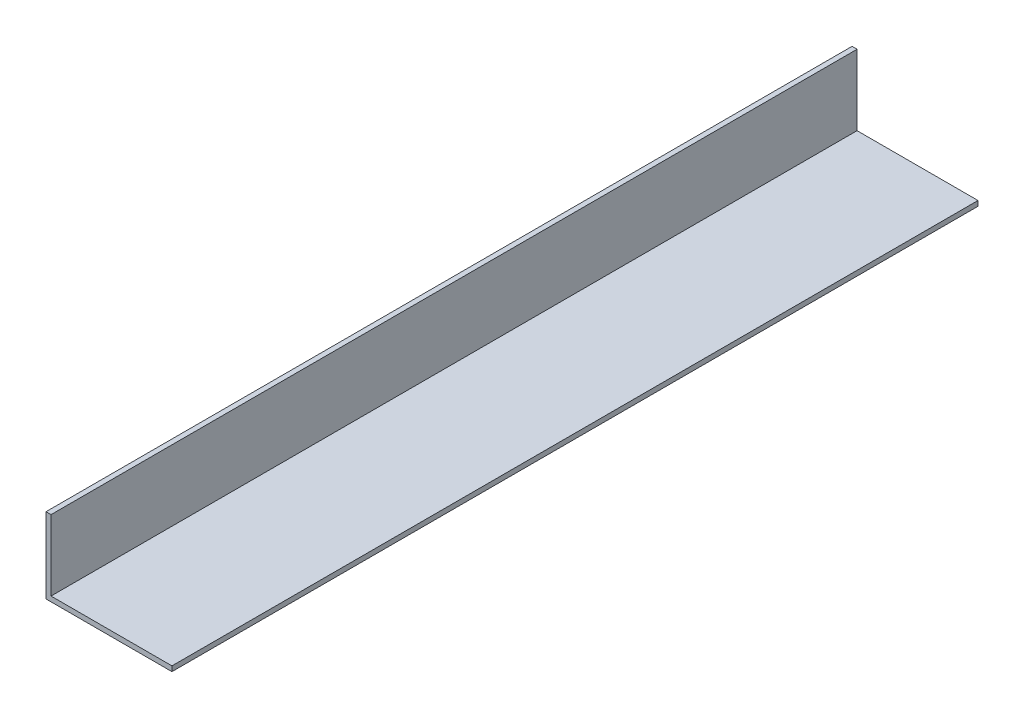
ISO-10303-21;
HEADER;
FILE_DESCRIPTION(('STEP AP214'),'2;1');
FILE_NAME('part.step','',(''),(''),'','','');
FILE_SCHEMA(('AUTOMOTIVE_DESIGN { 1 0 10303 214 1 1 1 1 }'));
ENDSEC;
DATA;
#1=APPLICATION_CONTEXT('core data for automotive mechanical design processes');
#2=APPLICATION_PROTOCOL_DEFINITION('international standard','automotive_design',2000,#1);
#3=PRODUCT_CONTEXT('',#1,'mechanical');
#4=PRODUCT('Part','Part','',(#3));
#5=PRODUCT_RELATED_PRODUCT_CATEGORY('part','',(#4));
#6=PRODUCT_DEFINITION_FORMATION('','',#4);
#7=PRODUCT_DEFINITION_CONTEXT('part definition',#1,'design');
#8=PRODUCT_DEFINITION('design','',#6,#7);
#9=PRODUCT_DEFINITION_SHAPE('','',#8);
#10=(LENGTH_UNIT() NAMED_UNIT(*) SI_UNIT(.MILLI.,.METRE.));
#11=(NAMED_UNIT(*) PLANE_ANGLE_UNIT() SI_UNIT($,.RADIAN.));
#12=(NAMED_UNIT(*) SI_UNIT($,.STERADIAN.) SOLID_ANGLE_UNIT());
#13=UNCERTAINTY_MEASURE_WITH_UNIT(LENGTH_MEASURE(1.E-05),#10,'distance_accuracy_value','');
#14=(GEOMETRIC_REPRESENTATION_CONTEXT(3) GLOBAL_UNCERTAINTY_ASSIGNED_CONTEXT((#13)) GLOBAL_UNIT_ASSIGNED_CONTEXT((#10,
#11,#12)) REPRESENTATION_CONTEXT('',''));
#15=CARTESIAN_POINT('',(0.,0.,0.));
#16=DIRECTION('',(0.,0.,1.));
#17=DIRECTION('',(1.,0.,0.));
#18=AXIS2_PLACEMENT_3D('',#15,#16,#17);
#19=CARTESIAN_POINT('',(50.,0.,320.));
#20=DIRECTION('',(0.,1.,0.));
#21=DIRECTION('',(-1.,0.,0.));
#22=AXIS2_PLACEMENT_3D('',#19,#20,#21);
#23=PLANE('',#22);
#24=DIRECTION('',(1.,0.,0.));
#25=VECTOR('',#24,1.);
#26=CARTESIAN_POINT('',(50.,0.,0.));
#27=LINE('',#26,#25);
#28=CARTESIAN_POINT('',(0.,0.,0.));
#29=VERTEX_POINT('',#28);
#30=CARTESIAN_POINT('',(50.,0.,0.));
#31=VERTEX_POINT('',#30);
#32=EDGE_CURVE('E119',#29,#31,#27,.T.);
#33=ORIENTED_EDGE('',*,*,#32,.T.);
#34=DIRECTION('',(0.,0.,-1.));
#35=VECTOR('',#34,1.);
#36=CARTESIAN_POINT('',(50.,0.,320.));
#37=LINE('',#36,#35);
#38=CARTESIAN_POINT('',(50.,0.,320.));
#39=VERTEX_POINT('',#38);
#40=EDGE_CURVE('E11',#39,#31,#37,.T.);
#41=ORIENTED_EDGE('',*,*,#40,.F.);
#42=DIRECTION('',(1.,0.,0.));
#43=VECTOR('',#42,1.);
#44=CARTESIAN_POINT('',(50.,0.,320.));
#45=LINE('',#44,#43);
#46=CARTESIAN_POINT('',(0.,0.,320.));
#47=VERTEX_POINT('',#46);
#48=EDGE_CURVE('E129',#47,#39,#45,.T.);
#49=ORIENTED_EDGE('',*,*,#48,.F.);
#50=DIRECTION('',(0.,0.,-1.));
#51=VECTOR('',#50,1.);
#52=CARTESIAN_POINT('',(0.,0.,320.));
#53=LINE('',#52,#51);
#54=EDGE_CURVE('E115',#47,#29,#53,.T.);
#55=ORIENTED_EDGE('',*,*,#54,.T.);
#56=EDGE_LOOP('',(#33,#41,#49,#55));
#57=FACE_BOUND('',#56,.T.);
#58=ADVANCED_FACE('F35',(#57),#23,.F.);
#59=CARTESIAN_POINT('',(50.,2.,320.));
#60=DIRECTION('',(-1.,0.,0.));
#61=DIRECTION('',(0.,0.,1.));
#62=AXIS2_PLACEMENT_3D('',#59,#60,#61);
#63=PLANE('',#62);
#64=DIRECTION('',(0.,1.,0.));
#65=VECTOR('',#64,1.);
#66=CARTESIAN_POINT('',(50.,2.,0.));
#67=LINE('',#66,#65);
#68=CARTESIAN_POINT('',(50.,2.,0.));
#69=VERTEX_POINT('',#68);
#70=EDGE_CURVE('E122',#31,#69,#67,.T.);
#71=ORIENTED_EDGE('',*,*,#70,.T.);
#72=DIRECTION('',(0.,0.,-1.));
#73=VECTOR('',#72,1.);
#74=CARTESIAN_POINT('',(50.,2.,320.));
#75=LINE('',#74,#73);
#76=CARTESIAN_POINT('',(50.,2.,320.));
#77=VERTEX_POINT('',#76);
#78=EDGE_CURVE('E43',#77,#69,#75,.T.);
#79=ORIENTED_EDGE('',*,*,#78,.F.);
#80=DIRECTION('',(0.,1.,0.));
#81=VECTOR('',#80,1.);
#82=CARTESIAN_POINT('',(50.,2.,320.));
#83=LINE('',#82,#81);
#84=EDGE_CURVE('E88',#39,#77,#83,.T.);
#85=ORIENTED_EDGE('',*,*,#84,.F.);
#86=ORIENTED_EDGE('',*,*,#40,.T.);
#87=EDGE_LOOP('',(#71,#79,#85,#86));
#88=FACE_BOUND('',#87,.T.);
#89=ADVANCED_FACE('F153',(#88),#63,.F.);
#90=CARTESIAN_POINT('',(2.,2.,320.));
#91=DIRECTION('',(0.,-1.,0.));
#92=DIRECTION('',(0.,0.,-1.));
#93=AXIS2_PLACEMENT_3D('',#90,#91,#92);
#94=PLANE('',#93);
#95=DIRECTION('',(-1.,0.,0.));
#96=VECTOR('',#95,1.);
#97=CARTESIAN_POINT('',(2.,2.,0.));
#98=LINE('',#97,#96);
#99=CARTESIAN_POINT('',(2.,2.,0.));
#100=VERTEX_POINT('',#99);
#101=EDGE_CURVE('E124',#69,#100,#98,.T.);
#102=ORIENTED_EDGE('',*,*,#101,.T.);
#103=DIRECTION('',(0.,0.,-1.));
#104=VECTOR('',#103,1.);
#105=CARTESIAN_POINT('',(2.,2.,320.));
#106=LINE('',#105,#104);
#107=CARTESIAN_POINT('',(2.,2.,320.));
#108=VERTEX_POINT('',#107);
#109=EDGE_CURVE('E110',#108,#100,#106,.T.);
#110=ORIENTED_EDGE('',*,*,#109,.F.);
#111=DIRECTION('',(-1.,0.,0.));
#112=VECTOR('',#111,1.);
#113=CARTESIAN_POINT('',(2.,2.,320.));
#114=LINE('',#113,#112);
#115=EDGE_CURVE('E101',#77,#108,#114,.T.);
#116=ORIENTED_EDGE('',*,*,#115,.F.);
#117=ORIENTED_EDGE('',*,*,#78,.T.);
#118=EDGE_LOOP('',(#102,#110,#116,#117));
#119=FACE_BOUND('',#118,.T.);
#120=ADVANCED_FACE('F135',(#119),#94,.F.);
#121=CARTESIAN_POINT('',(2.,30.,320.));
#122=DIRECTION('',(-1.,0.,0.));
#123=DIRECTION('',(0.,0.,1.));
#124=AXIS2_PLACEMENT_3D('',#121,#122,#123);
#125=PLANE('',#124);
#126=DIRECTION('',(0.,1.,0.));
#127=VECTOR('',#126,1.);
#128=CARTESIAN_POINT('',(2.,30.,0.));
#129=LINE('',#128,#127);
#130=CARTESIAN_POINT('',(2.,30.,0.));
#131=VERTEX_POINT('',#130);
#132=EDGE_CURVE('E109',#100,#131,#129,.T.);
#133=ORIENTED_EDGE('',*,*,#132,.T.);
#134=DIRECTION('',(0.,0.,-1.));
#135=VECTOR('',#134,1.);
#136=CARTESIAN_POINT('',(2.,30.,320.));
#137=LINE('',#136,#135);
#138=CARTESIAN_POINT('',(2.,30.,320.));
#139=VERTEX_POINT('',#138);
#140=EDGE_CURVE('E106',#139,#131,#137,.T.);
#141=ORIENTED_EDGE('',*,*,#140,.F.);
#142=DIRECTION('',(0.,1.,0.));
#143=VECTOR('',#142,1.);
#144=CARTESIAN_POINT('',(2.,30.,320.));
#145=LINE('',#144,#143);
#146=EDGE_CURVE('E95',#108,#139,#145,.T.);
#147=ORIENTED_EDGE('',*,*,#146,.F.);
#148=ORIENTED_EDGE('',*,*,#109,.T.);
#149=EDGE_LOOP('',(#133,#141,#147,#148));
#150=FACE_BOUND('',#149,.T.);
#151=ADVANCED_FACE('F107',(#150),#125,.F.);
#152=CARTESIAN_POINT('',(0.,30.,320.));
#153=DIRECTION('',(0.,-1.,0.));
#154=DIRECTION('',(0.,0.,-1.));
#155=AXIS2_PLACEMENT_3D('',#152,#153,#154);
#156=PLANE('',#155);
#157=DIRECTION('',(-1.,0.,0.));
#158=VECTOR('',#157,1.);
#159=CARTESIAN_POINT('',(0.,30.,0.));
#160=LINE('',#159,#158);
#161=CARTESIAN_POINT('',(0.,30.,0.));
#162=VERTEX_POINT('',#161);
#163=EDGE_CURVE('E74',#131,#162,#160,.T.);
#164=ORIENTED_EDGE('',*,*,#163,.T.);
#165=DIRECTION('',(0.,0.,-1.));
#166=VECTOR('',#165,1.);
#167=CARTESIAN_POINT('',(0.,30.,320.));
#168=LINE('',#167,#166);
#169=CARTESIAN_POINT('',(0.,30.,320.));
#170=VERTEX_POINT('',#169);
#171=EDGE_CURVE('E111',#170,#162,#168,.T.);
#172=ORIENTED_EDGE('',*,*,#171,.F.);
#173=DIRECTION('',(-1.,0.,0.));
#174=VECTOR('',#173,1.);
#175=CARTESIAN_POINT('',(0.,30.,320.));
#176=LINE('',#175,#174);
#177=EDGE_CURVE('E99',#139,#170,#176,.T.);
#178=ORIENTED_EDGE('',*,*,#177,.F.);
#179=ORIENTED_EDGE('',*,*,#140,.T.);
#180=EDGE_LOOP('',(#164,#172,#178,#179));
#181=FACE_BOUND('',#180,.T.);
#182=ADVANCED_FACE('F113',(#181),#156,.F.);
#183=CARTESIAN_POINT('',(0.,0.,320.));
#184=DIRECTION('',(1.,0.,0.));
#185=DIRECTION('',(0.,0.,-1.));
#186=AXIS2_PLACEMENT_3D('',#183,#184,#185);
#187=PLANE('',#186);
#188=DIRECTION('',(0.,-1.,0.));
#189=VECTOR('',#188,1.);
#190=CARTESIAN_POINT('',(0.,0.,0.));
#191=LINE('',#190,#189);
#192=EDGE_CURVE('E80',#162,#29,#191,.T.);
#193=ORIENTED_EDGE('',*,*,#192,.T.);
#194=ORIENTED_EDGE('',*,*,#54,.F.);
#195=DIRECTION('',(0.,-1.,0.));
#196=VECTOR('',#195,1.);
#197=CARTESIAN_POINT('',(0.,0.,320.));
#198=LINE('',#197,#196);
#199=EDGE_CURVE('E51',#170,#47,#198,.T.);
#200=ORIENTED_EDGE('',*,*,#199,.F.);
#201=ORIENTED_EDGE('',*,*,#171,.T.);
#202=EDGE_LOOP('',(#193,#194,#200,#201));
#203=FACE_BOUND('',#202,.T.);
#204=ADVANCED_FACE('F142',(#203),#187,.F.);
#205=CARTESIAN_POINT('',(0.,0.,320.));
#206=DIRECTION('',(0.,0.,-1.));
#207=DIRECTION('',(-1.,0.,0.));
#208=AXIS2_PLACEMENT_3D('',#205,#206,#207);
#209=PLANE('',#208);
#210=ORIENTED_EDGE('',*,*,#48,.T.);
#211=ORIENTED_EDGE('',*,*,#84,.T.);
#212=ORIENTED_EDGE('',*,*,#115,.T.);
#213=ORIENTED_EDGE('',*,*,#146,.T.);
#214=ORIENTED_EDGE('',*,*,#177,.T.);
#215=ORIENTED_EDGE('',*,*,#199,.T.);
#216=EDGE_LOOP('',(#210,#211,#212,#213,#214,#215));
#217=FACE_BOUND('',#216,.T.);
#218=ADVANCED_FACE('F97',(#217),#209,.F.);
#219=CARTESIAN_POINT('',(0.,0.,0.));
#220=DIRECTION('',(0.,0.,-1.));
#221=DIRECTION('',(-1.,0.,0.));
#222=AXIS2_PLACEMENT_3D('',#219,#220,#221);
#223=PLANE('',#222);
#224=ORIENTED_EDGE('',*,*,#32,.F.);
#225=ORIENTED_EDGE('',*,*,#192,.F.);
#226=ORIENTED_EDGE('',*,*,#163,.F.);
#227=ORIENTED_EDGE('',*,*,#132,.F.);
#228=ORIENTED_EDGE('',*,*,#101,.F.);
#229=ORIENTED_EDGE('',*,*,#70,.F.);
#230=EDGE_LOOP('',(#224,#225,#226,#227,#228,#229));
#231=FACE_BOUND('',#230,.T.);
#232=ADVANCED_FACE('F138',(#231),#223,.T.);
#233=CLOSED_SHELL('',(#58,#89,#120,#151,#182,#204,#218,#232));
#234=MANIFOLD_SOLID_BREP('B2',#233);
#235=ADVANCED_BREP_SHAPE_REPRESENTATION('',(#18,#234),#14);
#236=SHAPE_DEFINITION_REPRESENTATION(#9,#235);
ENDSEC;
END-ISO-10303-21;
